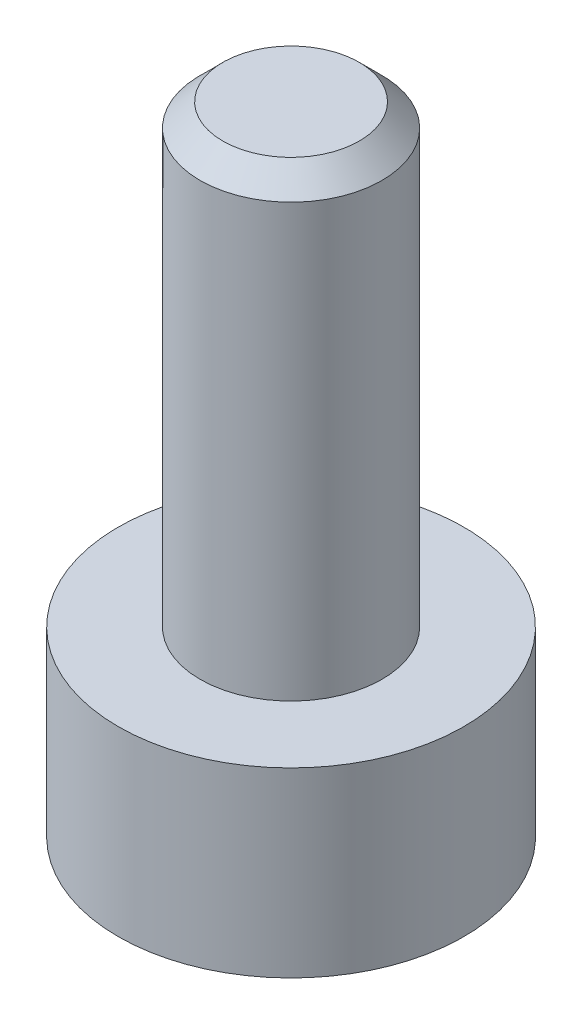
ISO-10303-21;
HEADER;
FILE_DESCRIPTION(('STEP AP214'),'2;1');
FILE_NAME('part.step','',(''),(''),'','','');
FILE_SCHEMA(('AUTOMOTIVE_DESIGN { 1 0 10303 214 1 1 1 1 }'));
ENDSEC;
DATA;
#1=APPLICATION_CONTEXT('core data for automotive mechanical design processes');
#2=APPLICATION_PROTOCOL_DEFINITION('international standard','automotive_design',2000,#1);
#3=PRODUCT_CONTEXT('',#1,'mechanical');
#4=PRODUCT('Part','Part','',(#3));
#5=PRODUCT_RELATED_PRODUCT_CATEGORY('part','',(#4));
#6=PRODUCT_DEFINITION_FORMATION('','',#4);
#7=PRODUCT_DEFINITION_CONTEXT('part definition',#1,'design');
#8=PRODUCT_DEFINITION('design','',#6,#7);
#9=PRODUCT_DEFINITION_SHAPE('','',#8);
#10=(LENGTH_UNIT() NAMED_UNIT(*) SI_UNIT(.MILLI.,.METRE.));
#11=(NAMED_UNIT(*) PLANE_ANGLE_UNIT() SI_UNIT($,.RADIAN.));
#12=(NAMED_UNIT(*) SI_UNIT($,.STERADIAN.) SOLID_ANGLE_UNIT());
#13=UNCERTAINTY_MEASURE_WITH_UNIT(LENGTH_MEASURE(1.E-05),#10,'distance_accuracy_value','');
#14=(GEOMETRIC_REPRESENTATION_CONTEXT(3) GLOBAL_UNCERTAINTY_ASSIGNED_CONTEXT((#13)) GLOBAL_UNIT_ASSIGNED_CONTEXT((#10,
#11,#12)) REPRESENTATION_CONTEXT('',''));
#15=CARTESIAN_POINT('',(0.,0.,0.));
#16=DIRECTION('',(0.,0.,1.));
#17=DIRECTION('',(1.,0.,0.));
#18=AXIS2_PLACEMENT_3D('',#15,#16,#17);
#19=CARTESIAN_POINT('',(0.,2.,0.));
#20=DIRECTION('',(0.,-1.,0.));
#21=DIRECTION('',(0.,0.,-1.));
#22=AXIS2_PLACEMENT_3D('',#19,#20,#21);
#23=CYLINDRICAL_SURFACE('',#22,1.9);
#24=CARTESIAN_POINT('',(0.,2.,0.));
#25=DIRECTION('',(0.,1.,0.));
#26=DIRECTION('',(0.,0.,1.));
#27=AXIS2_PLACEMENT_3D('',#24,#25,#26);
#28=CIRCLE('',#27,1.9);
#29=CARTESIAN_POINT('',(0.,2.,1.9));
#30=VERTEX_POINT('',#29);
#31=EDGE_CURVE('E161',#30,#30,#28,.T.);
#32=ORIENTED_EDGE('',*,*,#31,.F.);
#33=EDGE_LOOP('',(#32));
#34=FACE_BOUND('',#33,.T.);
#35=CARTESIAN_POINT('',(0.,0.,0.));
#36=DIRECTION('',(0.,1.,0.));
#37=DIRECTION('',(0.,0.,1.));
#38=AXIS2_PLACEMENT_3D('',#35,#36,#37);
#39=CIRCLE('',#38,1.9);
#40=CARTESIAN_POINT('',(0.,0.,1.9));
#41=VERTEX_POINT('',#40);
#42=EDGE_CURVE('E152',#41,#41,#39,.T.);
#43=ORIENTED_EDGE('',*,*,#42,.T.);
#44=EDGE_LOOP('',(#43));
#45=FACE_BOUND('',#44,.T.);
#46=ADVANCED_FACE('F49',(#34,#45),#23,.T.);
#47=CARTESIAN_POINT('',(0.,2.,0.));
#48=DIRECTION('',(0.,1.,0.));
#49=DIRECTION('',(0.,0.,1.));
#50=AXIS2_PLACEMENT_3D('',#47,#48,#49);
#51=PLANE('',#50);
#52=CARTESIAN_POINT('',(0.,2.,0.));
#53=DIRECTION('',(0.,1.,0.));
#54=DIRECTION('',(0.,0.,1.));
#55=AXIS2_PLACEMENT_3D('',#52,#53,#54);
#56=CIRCLE('',#55,1.);
#57=CARTESIAN_POINT('',(0.,2.,1.));
#58=VERTEX_POINT('',#57);
#59=EDGE_CURVE('E158',#58,#58,#56,.T.);
#60=ORIENTED_EDGE('',*,*,#59,.F.);
#61=EDGE_LOOP('',(#60));
#62=FACE_BOUND('',#61,.T.);
#63=ORIENTED_EDGE('',*,*,#31,.T.);
#64=EDGE_LOOP('',(#63));
#65=FACE_BOUND('',#64,.T.);
#66=ADVANCED_FACE('F180',(#62,#65),#51,.T.);
#67=CARTESIAN_POINT('',(0.,0.,0.));
#68=DIRECTION('',(0.,1.,0.));
#69=DIRECTION('',(0.,0.,1.));
#70=AXIS2_PLACEMENT_3D('',#67,#68,#69);
#71=PLANE('',#70);
#72=DIRECTION('',(0.866025403784439,0.,0.5));
#73=VECTOR('',#72,1.);
#74=CARTESIAN_POINT('',(0.,0.,-0.842636121788247));
#75=LINE('',#74,#73);
#76=CARTESIAN_POINT('',(0.,0.,-0.842636121788247));
#77=VERTEX_POINT('',#76);
#78=CARTESIAN_POINT('',(0.75,0.,-0.409623419896027));
#79=VERTEX_POINT('',#78);
#80=EDGE_CURVE('E139',#77,#79,#75,.T.);
#81=ORIENTED_EDGE('',*,*,#80,.F.);
#82=DIRECTION('',(0.866025403784438,0.,-0.5));
#83=VECTOR('',#82,1.);
#84=CARTESIAN_POINT('',(-0.75,0.,-0.409623419896027));
#85=LINE('',#84,#83);
#86=CARTESIAN_POINT('',(-0.75,0.,-0.409623419896027));
#87=VERTEX_POINT('',#86);
#88=EDGE_CURVE('E65',#87,#77,#85,.T.);
#89=ORIENTED_EDGE('',*,*,#88,.F.);
#90=DIRECTION('',(0.,0.,-1.));
#91=VECTOR('',#90,1.);
#92=CARTESIAN_POINT('',(-0.75,0.,0.456401983888411));
#93=LINE('',#92,#91);
#94=CARTESIAN_POINT('',(-0.75,0.,0.456401983888411));
#95=VERTEX_POINT('',#94);
#96=EDGE_CURVE('E148',#95,#87,#93,.T.);
#97=ORIENTED_EDGE('',*,*,#96,.F.);
#98=DIRECTION('',(-0.866025403784439,0.,-0.5));
#99=VECTOR('',#98,1.);
#100=CARTESIAN_POINT('',(0.,0.,0.889414685780631));
#101=LINE('',#100,#99);
#102=CARTESIAN_POINT('',(0.,0.,0.889414685780631));
#103=VERTEX_POINT('',#102);
#104=EDGE_CURVE('E146',#103,#95,#101,.T.);
#105=ORIENTED_EDGE('',*,*,#104,.F.);
#106=DIRECTION('',(-0.866025403784439,0.,0.5));
#107=VECTOR('',#106,1.);
#108=CARTESIAN_POINT('',(0.75,0.,0.456401983888412));
#109=LINE('',#108,#107);
#110=CARTESIAN_POINT('',(0.75,0.,0.456401983888412));
#111=VERTEX_POINT('',#110);
#112=EDGE_CURVE('E113',#111,#103,#109,.T.);
#113=ORIENTED_EDGE('',*,*,#112,.F.);
#114=DIRECTION('',(0.,0.,1.));
#115=VECTOR('',#114,1.);
#116=CARTESIAN_POINT('',(0.75,0.,-0.409623419896027));
#117=LINE('',#116,#115);
#118=EDGE_CURVE('E142',#79,#111,#117,.T.);
#119=ORIENTED_EDGE('',*,*,#118,.F.);
#120=EDGE_LOOP('',(#81,#89,#97,#105,#113,#119));
#121=FACE_BOUND('',#120,.T.);
#122=ORIENTED_EDGE('',*,*,#42,.F.);
#123=EDGE_LOOP('',(#122));
#124=FACE_BOUND('',#123,.T.);
#125=ADVANCED_FACE('F185',(#121,#124),#71,.F.);
#126=CARTESIAN_POINT('',(0.,7.,0.));
#127=DIRECTION('',(0.,-1.,0.));
#128=DIRECTION('',(0.,0.,-1.));
#129=AXIS2_PLACEMENT_3D('',#126,#127,#128);
#130=CYLINDRICAL_SURFACE('',#129,1.);
#131=CARTESIAN_POINT('',(0.,6.75,0.));
#132=DIRECTION('',(0.,1.,0.));
#133=DIRECTION('',(0.,0.,1.));
#134=AXIS2_PLACEMENT_3D('',#131,#132,#133);
#135=CIRCLE('',#134,1.);
#136=CARTESIAN_POINT('',(0.,6.75,1.));
#137=VERTEX_POINT('',#136);
#138=EDGE_CURVE('E11',#137,#137,#135,.F.);
#139=ORIENTED_EDGE('',*,*,#138,.T.);
#140=EDGE_LOOP('',(#139));
#141=FACE_BOUND('',#140,.T.);
#142=ORIENTED_EDGE('',*,*,#59,.T.);
#143=EDGE_LOOP('',(#142));
#144=FACE_BOUND('',#143,.T.);
#145=ADVANCED_FACE('F192',(#141,#144),#130,.T.);
#146=CARTESIAN_POINT('',(0.,7.,0.));
#147=DIRECTION('',(0.,1.,0.));
#148=DIRECTION('',(0.,0.,1.));
#149=AXIS2_PLACEMENT_3D('',#146,#147,#148);
#150=PLANE('',#149);
#151=CARTESIAN_POINT('',(0.,7.,0.));
#152=DIRECTION('',(0.,1.,0.));
#153=DIRECTION('',(0.,0.,1.));
#154=AXIS2_PLACEMENT_3D('',#151,#152,#153);
#155=CIRCLE('',#154,0.750000000000002);
#156=CARTESIAN_POINT('',(0.,7.,0.750000000000002));
#157=VERTEX_POINT('',#156);
#158=EDGE_CURVE('E58',#157,#157,#155,.T.);
#159=ORIENTED_EDGE('',*,*,#158,.T.);
#160=EDGE_LOOP('',(#159));
#161=FACE_BOUND('',#160,.T.);
#162=ADVANCED_FACE('F168',(#161),#150,.T.);
#163=CARTESIAN_POINT('',(-0.75,1.,-0.409623419896027));
#164=DIRECTION('',(-0.5,0.,-0.866025403784438));
#165=DIRECTION('',(-0.866025403784439,0.,0.5));
#166=AXIS2_PLACEMENT_3D('',#163,#164,#165);
#167=PLANE('',#166);
#168=ORIENTED_EDGE('',*,*,#88,.T.);
#169=DIRECTION('',(0.,-1.,0.));
#170=VECTOR('',#169,1.);
#171=CARTESIAN_POINT('',(0.,1.,-0.842636121788247));
#172=LINE('',#171,#170);
#173=CARTESIAN_POINT('',(0.,1.,-0.842636121788247));
#174=VERTEX_POINT('',#173);
#175=EDGE_CURVE('E95',#174,#77,#172,.T.);
#176=ORIENTED_EDGE('',*,*,#175,.F.);
#177=DIRECTION('',(0.866025403784438,0.,-0.5));
#178=VECTOR('',#177,1.);
#179=CARTESIAN_POINT('',(-0.75,1.,-0.409623419896027));
#180=LINE('',#179,#178);
#181=CARTESIAN_POINT('',(-0.75,1.,-0.409623419896027));
#182=VERTEX_POINT('',#181);
#183=EDGE_CURVE('E150',#182,#174,#180,.T.);
#184=ORIENTED_EDGE('',*,*,#183,.F.);
#185=DIRECTION('',(0.,-1.,0.));
#186=VECTOR('',#185,1.);
#187=CARTESIAN_POINT('',(-0.75,1.,-0.409623419896027));
#188=LINE('',#187,#186);
#189=EDGE_CURVE('E73',#182,#87,#188,.T.);
#190=ORIENTED_EDGE('',*,*,#189,.T.);
#191=EDGE_LOOP('',(#168,#176,#184,#190));
#192=FACE_BOUND('',#191,.T.);
#193=ADVANCED_FACE('F200',(#192),#167,.F.);
#194=CARTESIAN_POINT('',(-0.75,1.,0.456401983888411));
#195=DIRECTION('',(-1.,0.,0.));
#196=DIRECTION('',(0.,0.,1.));
#197=AXIS2_PLACEMENT_3D('',#194,#195,#196);
#198=PLANE('',#197);
#199=ORIENTED_EDGE('',*,*,#96,.T.);
#200=ORIENTED_EDGE('',*,*,#189,.F.);
#201=DIRECTION('',(0.,0.,-1.));
#202=VECTOR('',#201,1.);
#203=CARTESIAN_POINT('',(-0.75,1.,0.456401983888411));
#204=LINE('',#203,#202);
#205=CARTESIAN_POINT('',(-0.75,1.,0.456401983888411));
#206=VERTEX_POINT('',#205);
#207=EDGE_CURVE('E125',#206,#182,#204,.T.);
#208=ORIENTED_EDGE('',*,*,#207,.F.);
#209=DIRECTION('',(0.,-1.,0.));
#210=VECTOR('',#209,1.);
#211=CARTESIAN_POINT('',(-0.75,1.,0.456401983888411));
#212=LINE('',#211,#210);
#213=EDGE_CURVE('E117',#206,#95,#212,.T.);
#214=ORIENTED_EDGE('',*,*,#213,.T.);
#215=EDGE_LOOP('',(#199,#200,#208,#214));
#216=FACE_BOUND('',#215,.T.);
#217=ADVANCED_FACE('F203',(#216),#198,.F.);
#218=CARTESIAN_POINT('',(0.,1.,0.889414685780631));
#219=DIRECTION('',(-0.5,0.,0.866025403784439));
#220=DIRECTION('',(0.866025403784439,0.,0.5));
#221=AXIS2_PLACEMENT_3D('',#218,#219,#220);
#222=PLANE('',#221);
#223=ORIENTED_EDGE('',*,*,#104,.T.);
#224=ORIENTED_EDGE('',*,*,#213,.F.);
#225=DIRECTION('',(-0.866025403784439,0.,-0.5));
#226=VECTOR('',#225,1.);
#227=CARTESIAN_POINT('',(0.,1.,0.889414685780631));
#228=LINE('',#227,#226);
#229=CARTESIAN_POINT('',(0.,1.,0.889414685780631));
#230=VERTEX_POINT('',#229);
#231=EDGE_CURVE('E121',#230,#206,#228,.T.);
#232=ORIENTED_EDGE('',*,*,#231,.F.);
#233=DIRECTION('',(0.,-1.,0.));
#234=VECTOR('',#233,1.);
#235=CARTESIAN_POINT('',(0.,1.,0.889414685780631));
#236=LINE('',#235,#234);
#237=EDGE_CURVE('E106',#230,#103,#236,.T.);
#238=ORIENTED_EDGE('',*,*,#237,.T.);
#239=EDGE_LOOP('',(#223,#224,#232,#238));
#240=FACE_BOUND('',#239,.T.);
#241=ADVANCED_FACE('F122',(#240),#222,.F.);
#242=CARTESIAN_POINT('',(0.75,1.,0.456401983888412));
#243=DIRECTION('',(0.5,0.,0.866025403784439));
#244=DIRECTION('',(0.866025403784439,0.,-0.5));
#245=AXIS2_PLACEMENT_3D('',#242,#243,#244);
#246=PLANE('',#245);
#247=ORIENTED_EDGE('',*,*,#112,.T.);
#248=ORIENTED_EDGE('',*,*,#237,.F.);
#249=DIRECTION('',(-0.866025403784439,0.,0.5));
#250=VECTOR('',#249,1.);
#251=CARTESIAN_POINT('',(0.75,1.,0.456401983888412));
#252=LINE('',#251,#250);
#253=CARTESIAN_POINT('',(0.75,1.,0.456401983888412));
#254=VERTEX_POINT('',#253);
#255=EDGE_CURVE('E110',#254,#230,#252,.T.);
#256=ORIENTED_EDGE('',*,*,#255,.F.);
#257=DIRECTION('',(0.,-1.,0.));
#258=VECTOR('',#257,1.);
#259=CARTESIAN_POINT('',(0.75,1.,0.456401983888412));
#260=LINE('',#259,#258);
#261=EDGE_CURVE('E118',#254,#111,#260,.T.);
#262=ORIENTED_EDGE('',*,*,#261,.T.);
#263=EDGE_LOOP('',(#247,#248,#256,#262));
#264=FACE_BOUND('',#263,.T.);
#265=ADVANCED_FACE('F108',(#264),#246,.F.);
#266=CARTESIAN_POINT('',(0.75,1.,-0.409623419896027));
#267=DIRECTION('',(1.,0.,0.));
#268=DIRECTION('',(0.,0.,-1.));
#269=AXIS2_PLACEMENT_3D('',#266,#267,#268);
#270=PLANE('',#269);
#271=ORIENTED_EDGE('',*,*,#118,.T.);
#272=ORIENTED_EDGE('',*,*,#261,.F.);
#273=DIRECTION('',(0.,0.,1.));
#274=VECTOR('',#273,1.);
#275=CARTESIAN_POINT('',(0.75,1.,-0.409623419896027));
#276=LINE('',#275,#274);
#277=CARTESIAN_POINT('',(0.75,1.,-0.409623419896027));
#278=VERTEX_POINT('',#277);
#279=EDGE_CURVE('E131',#278,#254,#276,.T.);
#280=ORIENTED_EDGE('',*,*,#279,.F.);
#281=DIRECTION('',(0.,-1.,0.));
#282=VECTOR('',#281,1.);
#283=CARTESIAN_POINT('',(0.75,1.,-0.409623419896027));
#284=LINE('',#283,#282);
#285=EDGE_CURVE('E155',#278,#79,#284,.T.);
#286=ORIENTED_EDGE('',*,*,#285,.T.);
#287=EDGE_LOOP('',(#271,#272,#280,#286));
#288=FACE_BOUND('',#287,.T.);
#289=ADVANCED_FACE('F206',(#288),#270,.F.);
#290=CARTESIAN_POINT('',(0.,1.,-0.842636121788247));
#291=DIRECTION('',(0.5,0.,-0.866025403784439));
#292=DIRECTION('',(-0.866025403784439,0.,-0.5));
#293=AXIS2_PLACEMENT_3D('',#290,#291,#292);
#294=PLANE('',#293);
#295=ORIENTED_EDGE('',*,*,#80,.T.);
#296=ORIENTED_EDGE('',*,*,#285,.F.);
#297=DIRECTION('',(0.866025403784439,0.,0.5));
#298=VECTOR('',#297,1.);
#299=CARTESIAN_POINT('',(0.,1.,-0.842636121788247));
#300=LINE('',#299,#298);
#301=EDGE_CURVE('E133',#174,#278,#300,.T.);
#302=ORIENTED_EDGE('',*,*,#301,.F.);
#303=ORIENTED_EDGE('',*,*,#175,.T.);
#304=EDGE_LOOP('',(#295,#296,#302,#303));
#305=FACE_BOUND('',#304,.T.);
#306=ADVANCED_FACE('F176',(#305),#294,.F.);
#307=CARTESIAN_POINT('',(0.,1.,0.));
#308=DIRECTION('',(0.,-1.,0.));
#309=DIRECTION('',(0.,0.,-1.));
#310=AXIS2_PLACEMENT_3D('',#307,#308,#309);
#311=PLANE('',#310);
#312=ORIENTED_EDGE('',*,*,#183,.T.);
#313=ORIENTED_EDGE('',*,*,#301,.T.);
#314=ORIENTED_EDGE('',*,*,#279,.T.);
#315=ORIENTED_EDGE('',*,*,#255,.T.);
#316=ORIENTED_EDGE('',*,*,#231,.T.);
#317=ORIENTED_EDGE('',*,*,#207,.T.);
#318=EDGE_LOOP('',(#312,#313,#314,#315,#316,#317));
#319=FACE_BOUND('',#318,.T.);
#320=ADVANCED_FACE('F128',(#319),#311,.T.);
#321=CARTESIAN_POINT('',(0.,7.,0.));
#322=DIRECTION('',(0.,-1.,0.));
#323=DIRECTION('',(0.,0.,-1.));
#324=AXIS2_PLACEMENT_3D('',#321,#322,#323);
#325=CONICAL_SURFACE('',#324,0.750000000000002,0.785398163397446);
#326=ORIENTED_EDGE('',*,*,#138,.F.);
#327=EDGE_LOOP('',(#326));
#328=FACE_BOUND('',#327,.T.);
#329=ORIENTED_EDGE('',*,*,#158,.F.);
#330=EDGE_LOOP('',(#329));
#331=FACE_BOUND('',#330,.T.);
#332=ADVANCED_FACE('F52',(#328,#331),#325,.T.);
#333=CLOSED_SHELL('',(#46,#66,#125,#145,#162,#193,#217,#241,#265,#289,#306,#320,#332));
#334=MANIFOLD_SOLID_BREP('B2',#333);
#335=ADVANCED_BREP_SHAPE_REPRESENTATION('',(#18,#334),#14);
#336=SHAPE_DEFINITION_REPRESENTATION(#9,#335);
ENDSEC;
END-ISO-10303-21;
